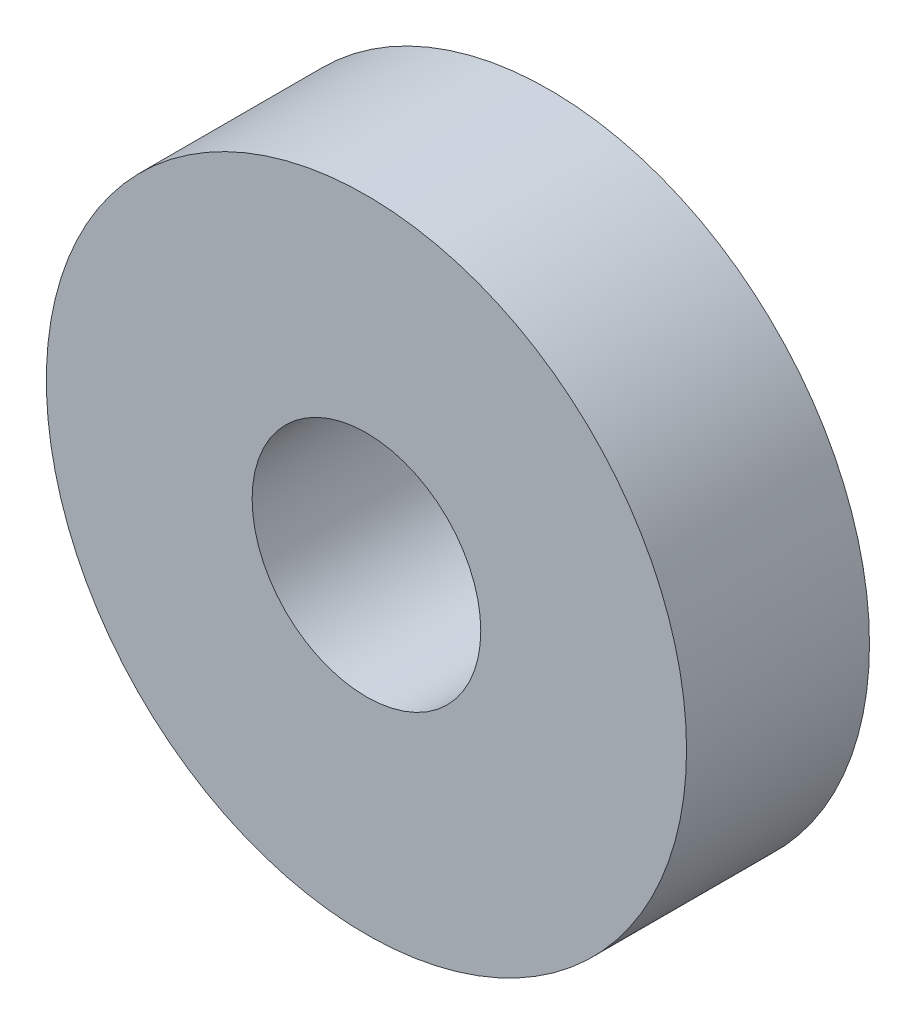
ISO-10303-21;
HEADER;
FILE_DESCRIPTION(('STEP AP214'),'2;1');
FILE_NAME('part.step','',(''),(''),'','','');
FILE_SCHEMA(('AUTOMOTIVE_DESIGN { 1 0 10303 214 1 1 1 1 }'));
ENDSEC;
DATA;
#1=APPLICATION_CONTEXT('core data for automotive mechanical design processes');
#2=APPLICATION_PROTOCOL_DEFINITION('international standard','automotive_design',2000,#1);
#3=PRODUCT_CONTEXT('',#1,'mechanical');
#4=PRODUCT('Part','Part','',(#3));
#5=PRODUCT_RELATED_PRODUCT_CATEGORY('part','',(#4));
#6=PRODUCT_DEFINITION_FORMATION('','',#4);
#7=PRODUCT_DEFINITION_CONTEXT('part definition',#1,'design');
#8=PRODUCT_DEFINITION('design','',#6,#7);
#9=PRODUCT_DEFINITION_SHAPE('','',#8);
#10=(LENGTH_UNIT() NAMED_UNIT(*) SI_UNIT(.MILLI.,.METRE.));
#11=(NAMED_UNIT(*) PLANE_ANGLE_UNIT() SI_UNIT($,.RADIAN.));
#12=(NAMED_UNIT(*) SI_UNIT($,.STERADIAN.) SOLID_ANGLE_UNIT());
#13=UNCERTAINTY_MEASURE_WITH_UNIT(LENGTH_MEASURE(1.E-05),#10,'distance_accuracy_value','');
#14=(GEOMETRIC_REPRESENTATION_CONTEXT(3) GLOBAL_UNCERTAINTY_ASSIGNED_CONTEXT((#13)) GLOBAL_UNIT_ASSIGNED_CONTEXT((#10,
#11,#12)) REPRESENTATION_CONTEXT('',''));
#15=CARTESIAN_POINT('',(0.,0.,0.));
#16=DIRECTION('',(0.,0.,1.));
#17=DIRECTION('',(1.,0.,0.));
#18=AXIS2_PLACEMENT_3D('',#15,#16,#17);
#19=CARTESIAN_POINT('',(0.,0.,4.));
#20=DIRECTION('',(0.,0.,-1.));
#21=DIRECTION('',(-1.,0.,0.));
#22=AXIS2_PLACEMENT_3D('',#19,#20,#21);
#23=CYLINDRICAL_SURFACE('',#22,7.);
#24=CARTESIAN_POINT('',(0.,0.,4.));
#25=DIRECTION('',(0.,0.,1.));
#26=DIRECTION('',(1.,0.,0.));
#27=AXIS2_PLACEMENT_3D('',#24,#25,#26);
#28=CIRCLE('',#27,7.);
#29=CARTESIAN_POINT('',(7.,0.,4.));
#30=VERTEX_POINT('',#29);
#31=EDGE_CURVE('E10',#30,#30,#28,.T.);
#32=ORIENTED_EDGE('',*,*,#31,.F.);
#33=EDGE_LOOP('',(#32));
#34=FACE_BOUND('',#33,.T.);
#35=CARTESIAN_POINT('',(0.,0.,0.));
#36=DIRECTION('',(0.,0.,1.));
#37=DIRECTION('',(1.,0.,0.));
#38=AXIS2_PLACEMENT_3D('',#35,#36,#37);
#39=CIRCLE('',#38,7.);
#40=CARTESIAN_POINT('',(7.,0.,0.));
#41=VERTEX_POINT('',#40);
#42=EDGE_CURVE('E36',#41,#41,#39,.T.);
#43=ORIENTED_EDGE('',*,*,#42,.T.);
#44=EDGE_LOOP('',(#43));
#45=FACE_BOUND('',#44,.T.);
#46=ADVANCED_FACE('F33',(#34,#45),#23,.T.);
#47=CARTESIAN_POINT('',(0.,0.,4.));
#48=DIRECTION('',(0.,0.,1.));
#49=DIRECTION('',(1.,0.,0.));
#50=AXIS2_PLACEMENT_3D('',#47,#48,#49);
#51=PLANE('',#50);
#52=CARTESIAN_POINT('',(0.,0.,4.));
#53=DIRECTION('',(0.,0.,1.));
#54=DIRECTION('',(1.,0.,0.));
#55=AXIS2_PLACEMENT_3D('',#52,#53,#54);
#56=CIRCLE('',#55,2.5);
#57=CARTESIAN_POINT('',(2.5,0.,4.));
#58=VERTEX_POINT('',#57);
#59=EDGE_CURVE('E45',#58,#58,#56,.T.);
#60=ORIENTED_EDGE('',*,*,#59,.F.);
#61=EDGE_LOOP('',(#60));
#62=FACE_BOUND('',#61,.T.);
#63=ORIENTED_EDGE('',*,*,#31,.T.);
#64=EDGE_LOOP('',(#63));
#65=FACE_BOUND('',#64,.T.);
#66=ADVANCED_FACE('F60',(#62,#65),#51,.T.);
#67=CARTESIAN_POINT('',(0.,0.,0.));
#68=DIRECTION('',(0.,0.,1.));
#69=DIRECTION('',(1.,0.,0.));
#70=AXIS2_PLACEMENT_3D('',#67,#68,#69);
#71=PLANE('',#70);
#72=CARTESIAN_POINT('',(0.,0.,0.));
#73=DIRECTION('',(0.,0.,1.));
#74=DIRECTION('',(1.,0.,0.));
#75=AXIS2_PLACEMENT_3D('',#72,#73,#74);
#76=CIRCLE('',#75,2.5);
#77=CARTESIAN_POINT('',(2.5,0.,0.));
#78=VERTEX_POINT('',#77);
#79=EDGE_CURVE('E43',#78,#78,#76,.T.);
#80=ORIENTED_EDGE('',*,*,#79,.T.);
#81=EDGE_LOOP('',(#80));
#82=FACE_BOUND('',#81,.T.);
#83=ORIENTED_EDGE('',*,*,#42,.F.);
#84=EDGE_LOOP('',(#83));
#85=FACE_BOUND('',#84,.T.);
#86=ADVANCED_FACE('F51',(#82,#85),#71,.F.);
#87=CARTESIAN_POINT('',(0.,0.,0.));
#88=DIRECTION('',(0.,0.,1.));
#89=DIRECTION('',(1.,0.,0.));
#90=AXIS2_PLACEMENT_3D('',#87,#88,#89);
#91=CYLINDRICAL_SURFACE('',#90,2.5);
#92=ORIENTED_EDGE('',*,*,#79,.F.);
#93=EDGE_LOOP('',(#92));
#94=FACE_BOUND('',#93,.T.);
#95=ORIENTED_EDGE('',*,*,#59,.T.);
#96=EDGE_LOOP('',(#95));
#97=FACE_BOUND('',#96,.T.);
#98=ADVANCED_FACE('F54',(#94,#97),#91,.F.);
#99=CLOSED_SHELL('',(#46,#66,#86,#98));
#100=MANIFOLD_SOLID_BREP('B2',#99);
#101=ADVANCED_BREP_SHAPE_REPRESENTATION('',(#18,#100),#14);
#102=SHAPE_DEFINITION_REPRESENTATION(#9,#101);
ENDSEC;
END-ISO-10303-21;
